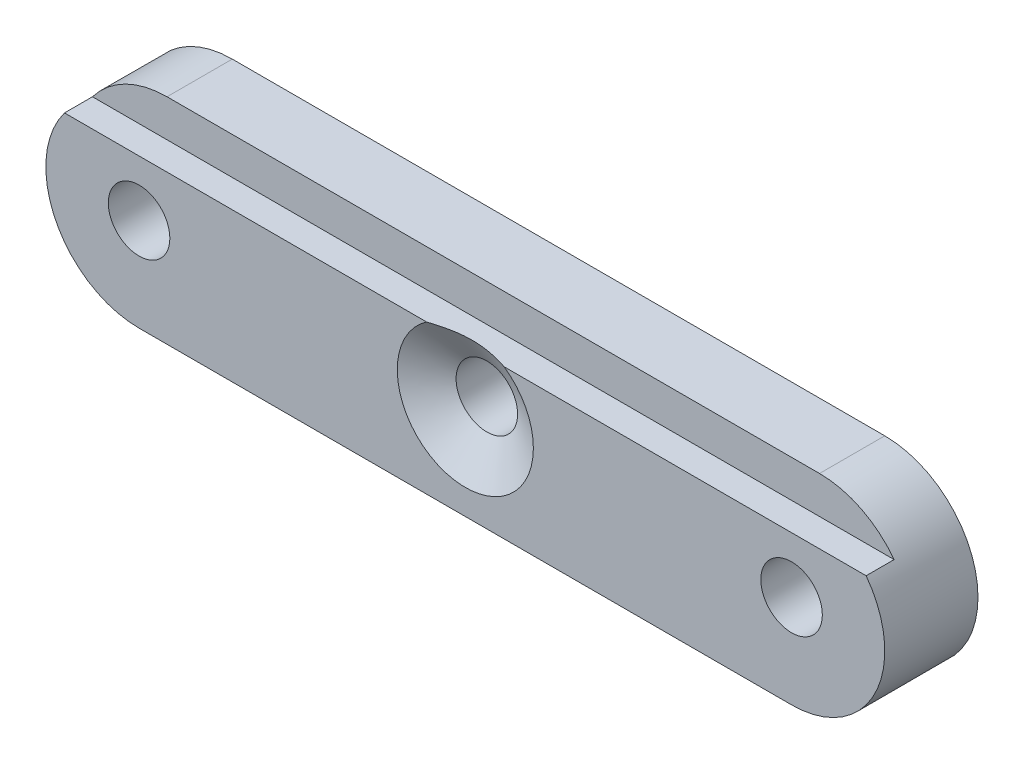
ISO-10303-21;
HEADER;
FILE_DESCRIPTION(('STEP AP214'),'2;1');
FILE_NAME('part.step','',(''),(''),'','','');
FILE_SCHEMA(('AUTOMOTIVE_DESIGN { 1 0 10303 214 1 1 1 1 }'));
ENDSEC;
DATA;
#1=APPLICATION_CONTEXT('core data for automotive mechanical design processes');
#2=APPLICATION_PROTOCOL_DEFINITION('international standard','automotive_design',2000,#1);
#3=PRODUCT_CONTEXT('',#1,'mechanical');
#4=PRODUCT('Part','Part','',(#3));
#5=PRODUCT_RELATED_PRODUCT_CATEGORY('part','',(#4));
#6=PRODUCT_DEFINITION_FORMATION('','',#4);
#7=PRODUCT_DEFINITION_CONTEXT('part definition',#1,'design');
#8=PRODUCT_DEFINITION('design','',#6,#7);
#9=PRODUCT_DEFINITION_SHAPE('','',#8);
#10=(LENGTH_UNIT() NAMED_UNIT(*) SI_UNIT(.MILLI.,.METRE.));
#11=(NAMED_UNIT(*) PLANE_ANGLE_UNIT() SI_UNIT($,.RADIAN.));
#12=(NAMED_UNIT(*) SI_UNIT($,.STERADIAN.) SOLID_ANGLE_UNIT());
#13=UNCERTAINTY_MEASURE_WITH_UNIT(LENGTH_MEASURE(1.E-05),#10,'distance_accuracy_value','');
#14=(GEOMETRIC_REPRESENTATION_CONTEXT(3) GLOBAL_UNCERTAINTY_ASSIGNED_CONTEXT((#13)) GLOBAL_UNIT_ASSIGNED_CONTEXT((#10,
#11,#12)) REPRESENTATION_CONTEXT('',''));
#15=CARTESIAN_POINT('',(0.,0.,0.));
#16=DIRECTION('',(0.,0.,1.));
#17=DIRECTION('',(1.,0.,0.));
#18=AXIS2_PLACEMENT_3D('',#15,#16,#17);
#19=CARTESIAN_POINT('',(0.,0.,5.));
#20=DIRECTION('',(0.,0.,1.));
#21=DIRECTION('',(1.,0.,0.));
#22=AXIS2_PLACEMENT_3D('',#19,#20,#21);
#23=PLANE('',#22);
#24=CARTESIAN_POINT('',(35.,0.,5.));
#25=DIRECTION('',(0.,0.,1.));
#26=DIRECTION('',(1.,0.,0.));
#27=AXIS2_PLACEMENT_3D('',#24,#25,#26);
#28=CIRCLE('',#27,1.65);
#29=CARTESIAN_POINT('',(36.65,0.,5.));
#30=VERTEX_POINT('',#29);
#31=EDGE_CURVE('E106',#30,#30,#28,.T.);
#32=ORIENTED_EDGE('',*,*,#31,.F.);
#33=EDGE_LOOP('',(#32));
#34=FACE_BOUND('',#33,.T.);
#35=CARTESIAN_POINT('',(0.,0.,5.));
#36=DIRECTION('',(0.,0.,1.));
#37=DIRECTION('',(1.,0.,0.));
#38=AXIS2_PLACEMENT_3D('',#35,#36,#37);
#39=CIRCLE('',#38,1.65);
#40=CARTESIAN_POINT('',(1.65,0.,5.));
#41=VERTEX_POINT('',#40);
#42=EDGE_CURVE('E270',#41,#41,#39,.T.);
#43=ORIENTED_EDGE('',*,*,#42,.F.);
#44=EDGE_LOOP('',(#43));
#45=FACE_BOUND('',#44,.T.);
#46=CARTESIAN_POINT('',(35.,0.,5.));
#47=DIRECTION('',(0.,0.,1.));
#48=DIRECTION('',(1.,0.,0.));
#49=AXIS2_PLACEMENT_3D('',#46,#47,#48);
#50=CIRCLE('',#49,5.);
#51=CARTESIAN_POINT('',(35.,-5.,5.));
#52=VERTEX_POINT('',#51);
#53=CARTESIAN_POINT('',(39.,3.,5.));
#54=VERTEX_POINT('',#53);
#55=EDGE_CURVE('E90',#52,#54,#50,.T.);
#56=ORIENTED_EDGE('',*,*,#55,.T.);
#57=DIRECTION('',(-1.,0.,0.));
#58=VECTOR('',#57,1.);
#59=CARTESIAN_POINT('',(47.5,3.,5.));
#60=LINE('',#59,#58);
#61=CARTESIAN_POINT('',(19.5790622886292,3.,5.));
#62=VERTEX_POINT('',#61);
#63=EDGE_CURVE('E263',#54,#62,#60,.T.);
#64=ORIENTED_EDGE('',*,*,#63,.T.);
#65=CARTESIAN_POINT('',(17.5,0.,5.));
#66=DIRECTION('',(0.,0.,1.));
#67=DIRECTION('',(1.,0.,0.));
#68=AXIS2_PLACEMENT_3D('',#65,#66,#67);
#69=CIRCLE('',#68,3.65000000000001);
#70=CARTESIAN_POINT('',(15.4209377113708,3.,5.));
#71=VERTEX_POINT('',#70);
#72=EDGE_CURVE('E125',#62,#71,#69,.F.);
#73=ORIENTED_EDGE('',*,*,#72,.T.);
#74=CARTESIAN_POINT('',(-3.99999999999998,3.,5.));
#75=VERTEX_POINT('',#74);
#76=EDGE_CURVE('E49',#71,#75,#60,.T.);
#77=ORIENTED_EDGE('',*,*,#76,.T.);
#78=CARTESIAN_POINT('',(0.,0.,5.));
#79=DIRECTION('',(0.,0.,1.));
#80=DIRECTION('',(1.,0.,0.));
#81=AXIS2_PLACEMENT_3D('',#78,#79,#80);
#82=CIRCLE('',#81,5.);
#83=CARTESIAN_POINT('',(0.,-5.,5.));
#84=VERTEX_POINT('',#83);
#85=EDGE_CURVE('E99',#75,#84,#82,.T.);
#86=ORIENTED_EDGE('',*,*,#85,.T.);
#87=DIRECTION('',(1.,0.,0.));
#88=VECTOR('',#87,1.);
#89=CARTESIAN_POINT('',(0.,-5.,5.));
#90=LINE('',#89,#88);
#91=EDGE_CURVE('E58',#84,#52,#90,.T.);
#92=ORIENTED_EDGE('',*,*,#91,.T.);
#93=EDGE_LOOP('',(#56,#64,#73,#77,#86,#92));
#94=FACE_BOUND('',#93,.T.);
#95=ADVANCED_FACE('F33',(#34,#45,#94),#23,.T.);
#96=CARTESIAN_POINT('',(0.,0.,5.));
#97=DIRECTION('',(0.,0.,-1.));
#98=DIRECTION('',(-1.,0.,0.));
#99=AXIS2_PLACEMENT_3D('',#96,#97,#98);
#100=CYLINDRICAL_SURFACE('',#99,5.);
#101=DIRECTION('',(0.,0.,-1.));
#102=VECTOR('',#101,1.);
#103=CARTESIAN_POINT('',(-4.,3.,5.));
#104=LINE('',#103,#102);
#105=CARTESIAN_POINT('',(-4.,3.,3.5));
#106=VERTEX_POINT('',#105);
#107=EDGE_CURVE('E255',#106,#75,#104,.F.);
#108=ORIENTED_EDGE('',*,*,#107,.F.);
#109=CARTESIAN_POINT('',(0.,0.,3.5));
#110=DIRECTION('',(0.,0.,1.));
#111=DIRECTION('',(1.,0.,0.));
#112=AXIS2_PLACEMENT_3D('',#109,#110,#111);
#113=CIRCLE('',#112,5.);
#114=CARTESIAN_POINT('',(0.,5.,3.5));
#115=VERTEX_POINT('',#114);
#116=EDGE_CURVE('E86',#115,#106,#113,.T.);
#117=ORIENTED_EDGE('',*,*,#116,.F.);
#118=DIRECTION('',(0.,0.,-1.));
#119=VECTOR('',#118,1.);
#120=CARTESIAN_POINT('',(0.,5.,5.));
#121=LINE('',#120,#119);
#122=CARTESIAN_POINT('',(0.,5.,0.));
#123=VERTEX_POINT('',#122);
#124=EDGE_CURVE('E78',#115,#123,#121,.T.);
#125=ORIENTED_EDGE('',*,*,#124,.T.);
#126=CARTESIAN_POINT('',(0.,0.,0.));
#127=DIRECTION('',(0.,0.,1.));
#128=DIRECTION('',(1.,0.,0.));
#129=AXIS2_PLACEMENT_3D('',#126,#127,#128);
#130=CIRCLE('',#129,5.);
#131=CARTESIAN_POINT('',(0.,-5.,0.));
#132=VERTEX_POINT('',#131);
#133=EDGE_CURVE('E84',#123,#132,#130,.T.);
#134=ORIENTED_EDGE('',*,*,#133,.T.);
#135=DIRECTION('',(0.,0.,-1.));
#136=VECTOR('',#135,1.);
#137=CARTESIAN_POINT('',(0.,-5.,5.));
#138=LINE('',#137,#136);
#139=EDGE_CURVE('E120',#84,#132,#138,.T.);
#140=ORIENTED_EDGE('',*,*,#139,.F.);
#141=ORIENTED_EDGE('',*,*,#85,.F.);
#142=EDGE_LOOP('',(#108,#117,#125,#134,#140,#141));
#143=FACE_BOUND('',#142,.T.);
#144=ADVANCED_FACE('F81',(#143),#100,.T.);
#145=CARTESIAN_POINT('',(35.,0.,5.));
#146=DIRECTION('',(0.,0.,-1.));
#147=DIRECTION('',(-1.,0.,0.));
#148=AXIS2_PLACEMENT_3D('',#145,#146,#147);
#149=CYLINDRICAL_SURFACE('',#148,5.);
#150=DIRECTION('',(0.,0.,-1.));
#151=VECTOR('',#150,1.);
#152=CARTESIAN_POINT('',(39.,3.,5.));
#153=LINE('',#152,#151);
#154=CARTESIAN_POINT('',(39.,3.,3.5));
#155=VERTEX_POINT('',#154);
#156=EDGE_CURVE('E258',#54,#155,#153,.T.);
#157=ORIENTED_EDGE('',*,*,#156,.F.);
#158=ORIENTED_EDGE('',*,*,#55,.F.);
#159=DIRECTION('',(0.,0.,-1.));
#160=VECTOR('',#159,1.);
#161=CARTESIAN_POINT('',(35.,-5.,5.));
#162=LINE('',#161,#160);
#163=CARTESIAN_POINT('',(35.,-5.,0.));
#164=VERTEX_POINT('',#163);
#165=EDGE_CURVE('E117',#52,#164,#162,.T.);
#166=ORIENTED_EDGE('',*,*,#165,.T.);
#167=CARTESIAN_POINT('',(35.,0.,0.));
#168=DIRECTION('',(0.,0.,1.));
#169=DIRECTION('',(1.,0.,0.));
#170=AXIS2_PLACEMENT_3D('',#167,#168,#169);
#171=CIRCLE('',#170,5.);
#172=CARTESIAN_POINT('',(35.,5.,0.));
#173=VERTEX_POINT('',#172);
#174=EDGE_CURVE('E100',#164,#173,#171,.T.);
#175=ORIENTED_EDGE('',*,*,#174,.T.);
#176=DIRECTION('',(0.,0.,-1.));
#177=VECTOR('',#176,1.);
#178=CARTESIAN_POINT('',(35.,5.,5.));
#179=LINE('',#178,#177);
#180=CARTESIAN_POINT('',(35.,5.,3.5));
#181=VERTEX_POINT('',#180);
#182=EDGE_CURVE('E89',#181,#173,#179,.T.);
#183=ORIENTED_EDGE('',*,*,#182,.F.);
#184=CARTESIAN_POINT('',(35.,0.,3.5));
#185=DIRECTION('',(0.,0.,1.));
#186=DIRECTION('',(1.,0.,0.));
#187=AXIS2_PLACEMENT_3D('',#184,#185,#186);
#188=CIRCLE('',#187,5.);
#189=EDGE_CURVE('E251',#155,#181,#188,.T.);
#190=ORIENTED_EDGE('',*,*,#189,.F.);
#191=EDGE_LOOP('',(#157,#158,#166,#175,#183,#190));
#192=FACE_BOUND('',#191,.T.);
#193=ADVANCED_FACE('F158',(#192),#149,.T.);
#194=CARTESIAN_POINT('',(0.,5.,5.));
#195=DIRECTION('',(0.,-1.,0.));
#196=DIRECTION('',(0.,0.,-1.));
#197=AXIS2_PLACEMENT_3D('',#194,#195,#196);
#198=PLANE('',#197);
#199=DIRECTION('',(-1.,0.,0.));
#200=VECTOR('',#199,1.);
#201=CARTESIAN_POINT('',(0.,5.,3.5));
#202=LINE('',#201,#200);
#203=EDGE_CURVE('E11',#181,#115,#202,.T.);
#204=ORIENTED_EDGE('',*,*,#203,.F.);
#205=ORIENTED_EDGE('',*,*,#182,.T.);
#206=DIRECTION('',(-1.,0.,0.));
#207=VECTOR('',#206,1.);
#208=CARTESIAN_POINT('',(0.,5.,0.));
#209=LINE('',#208,#207);
#210=EDGE_CURVE('E93',#173,#123,#209,.T.);
#211=ORIENTED_EDGE('',*,*,#210,.T.);
#212=ORIENTED_EDGE('',*,*,#124,.F.);
#213=EDGE_LOOP('',(#204,#205,#211,#212));
#214=FACE_BOUND('',#213,.T.);
#215=ADVANCED_FACE('F94',(#214),#198,.F.);
#216=CARTESIAN_POINT('',(17.5,0.,3.84529946162074));
#217=DIRECTION('',(0.,0.,1.));
#218=DIRECTION('',(1.,0.,0.));
#219=AXIS2_PLACEMENT_3D('',#216,#217,#218);
#220=CONICAL_SURFACE('',#219,1.65,1.0471975511966);
#221=CARTESIAN_POINT('',(17.5,0.,3.84529946162074));
#222=DIRECTION('',(0.,0.,1.));
#223=DIRECTION('',(1.,0.,0.));
#224=AXIS2_PLACEMENT_3D('',#221,#222,#223);
#225=CIRCLE('',#224,1.65);
#226=CARTESIAN_POINT('',(19.15,0.,3.84529946162074));
#227=VERTEX_POINT('',#226);
#228=EDGE_CURVE('E122',#227,#227,#225,.T.);
#229=ORIENTED_EDGE('',*,*,#228,.F.);
#230=EDGE_LOOP('',(#229));
#231=FACE_BOUND('',#230,.T.);
#232=ORIENTED_EDGE('',*,*,#72,.F.);
#233=CARTESIAN_POINT('',(11.8275768130364,3.,6.59746052683489));
#234=CARTESIAN_POINT('',(11.969636635737,3.,6.52497023774775));
#235=CARTESIAN_POINT('',(12.1119296973573,3.,6.45293206153359));
#236=CARTESIAN_POINT('',(12.3971038629693,3.,6.31000312791637));
#237=CARTESIAN_POINT('',(12.5399850102233,3.,6.23911245689244));
#238=CARTESIAN_POINT('',(12.8268276933058,3.,6.09854054025786));
#239=CARTESIAN_POINT('',(12.9707911158722,3.,6.02886313622713));
#240=CARTESIAN_POINT('',(13.2595532564117,3.,5.89126758392139));
#241=CARTESIAN_POINT('',(13.4043519521653,3.,5.82334938911087));
#242=CARTESIAN_POINT('',(13.7026184796863,3.,5.68620810345814));
#243=CARTESIAN_POINT('',(13.8561414474863,3.,5.61710449947381));
#244=CARTESIAN_POINT('',(14.1645746583202,3.,5.48206966045741));
#245=CARTESIAN_POINT('',(14.3194848393563,3.,5.41613828448168));
#246=CARTESIAN_POINT('',(14.6308728104923,3.,5.2884923875688));
#247=CARTESIAN_POINT('',(14.7873489769874,3.,5.22677393205871));
#248=CARTESIAN_POINT('',(15.102352002231,3.,5.1088495367629));
#249=CARTESIAN_POINT('',(15.2608784755092,3.,5.05264257735562));
#250=CARTESIAN_POINT('',(15.5787314917077,3.,4.94810250856732));
#251=CARTESIAN_POINT('',(15.7380330145845,3.,4.89969432556152));
#252=CARTESIAN_POINT('',(16.0592629013179,3.,4.81236546526751));
#253=CARTESIAN_POINT('',(16.2211911803825,3.,4.77344448237864));
#254=CARTESIAN_POINT('',(16.5445814827427,3.,4.70837266828685));
#255=CARTESIAN_POINT('',(16.7059982711544,3.,4.68200213770297));
#256=CARTESIAN_POINT('',(17.0305573874198,3.,4.64341112056473));
#257=CARTESIAN_POINT('',(17.1936993465158,3.,4.63118766937235));
#258=CARTESIAN_POINT('',(17.4523894647919,3.,4.62406104077253));
#259=CARTESIAN_POINT('',(17.5478199876218,3.,4.62406755535801));
#260=CARTESIAN_POINT('',(17.7385449598578,3.,4.62932031223674));
#261=CARTESIAN_POINT('',(17.8338394039979,3.,4.63456675208099));
#262=CARTESIAN_POINT('',(18.0240294431737,3.,4.65010664505003));
#263=CARTESIAN_POINT('',(18.1189249509847,3.,4.66040114935146));
#264=CARTESIAN_POINT('',(18.3080924691116,3.,4.68567115154001));
#265=CARTESIAN_POINT('',(18.4023644256005,3.,4.70064704829069));
#266=CARTESIAN_POINT('',(18.5925325253511,3.,4.73524884265784));
#267=CARTESIAN_POINT('',(18.6884086654694,3.,4.75498372298772));
#268=CARTESIAN_POINT('',(18.8792728788192,3.,4.79833792619136));
#269=CARTESIAN_POINT('',(18.9742609350221,3.,4.82195732338881));
#270=CARTESIAN_POINT('',(19.1633572561023,3.,4.87254793682486));
#271=CARTESIAN_POINT('',(19.2574653186948,3.,4.89951990429996));
#272=CARTESIAN_POINT('',(19.4448037916195,3.,4.95631845518158));
#273=CARTESIAN_POINT('',(19.5380342547708,3.,4.98614486556816));
#274=CARTESIAN_POINT('',(19.8174449915881,3.,5.07955185652153));
#275=CARTESIAN_POINT('',(20.0024000262049,3.,5.146798185452));
#276=CARTESIAN_POINT('',(20.369650848058,3.,5.28823769272562));
#277=CARTESIAN_POINT('',(20.5519458032977,3.,5.36243299286995));
#278=CARTESIAN_POINT('',(20.9145869826454,3.,5.51591329105389));
#279=CARTESIAN_POINT('',(21.0949310361938,3.,5.59520338890547));
#280=CARTESIAN_POINT('',(21.4539223425371,3.,5.75746058546618));
#281=CARTESIAN_POINT('',(21.6325697879091,3.,5.84042726065089));
#282=CARTESIAN_POINT('',(21.9892015344136,3.,6.00942841262702));
#283=CARTESIAN_POINT('',(22.1671810408569,3.,6.09547297428677));
#284=CARTESIAN_POINT('',(22.5220974038462,3.,6.26969064533454));
#285=CARTESIAN_POINT('',(22.6990342357614,3.,6.35786380475704));
#286=CARTESIAN_POINT('',(23.2284012385517,3.,6.62472921625863));
#287=CARTESIAN_POINT('',(23.5795968113178,3.,6.80586790660069));
#288=CARTESIAN_POINT('',(24.23286218171,3.,7.14767846114433));
#289=CARTESIAN_POINT('',(24.5352026613741,3.,7.30783654521936));
#290=CARTESIAN_POINT('',(25.1387579831346,3.,7.6303770956514));
#291=CARTESIAN_POINT('',(25.4399726329758,3.,7.79275992164634));
#292=CARTESIAN_POINT('',(26.0393802935299,3.,8.11794849984844));
#293=CARTESIAN_POINT('',(26.3375794872633,3.,8.2807428780765));
#294=CARTESIAN_POINT('',(26.9332610468696,3.,8.6075068892022));
#295=CARTESIAN_POINT('',(27.230743536346,3.,8.7714762966664));
#296=CARTESIAN_POINT('',(27.5279916409577,3.,8.93586648786649));
#297=B_SPLINE_CURVE_WITH_KNOTS('',3,(#233,#234,#235,#236,#237,#238,#239,#240,#241,#242,#243,
#244,#245,#246,#247,#248,#249,#250,#251,#252,#253,#254,#255,#256,#257,#258,#259,#260,#261,#262,
#263,#264,#265,#266,#267,#268,#269,#270,#271,#272,#273,#274,#275,#276,#277,#278,#279,#280,#281,
#282,#283,#284,#285,#286,#287,#288,#289,#290,#291,#292,#293,#294,#295,#296),.UNSPECIFIED.,.F.,
.F.,(4,2,2,2,2,2,2,2,2,2,2,2,2,2,2,2,2,2,2,2,2,2,2,2,2,2,2,2,2,2,2,4),(0.,0.478461037642833,
0.956957925778476,1.43676455831152,1.91655848575936,2.42160690489359,2.92663286371891,
3.43118052111506,3.93563466087101,4.43489773236646,4.93414471952818,5.42429772430315,
5.91434799483521,6.20050886121125,6.48668051657672,6.77291178781745,7.05916745315831,
7.35273337665137,7.64630491768729,7.9399423605726,8.23356201610037,8.82373799229105,
9.41409476418753,10.0050519681987,10.5959412727879,11.1889855754295,11.7820438316767,
12.9674650261525,13.9938791322107,15.0204611669965,16.0396849685133,17.0587182015138),.UNSPECIFIED.);
#298=EDGE_CURVE('E42',#62,#71,#297,.F.);
#299=ORIENTED_EDGE('',*,*,#298,.T.);
#300=EDGE_LOOP('',(#232,#299));
#301=FACE_BOUND('',#300,.T.);
#302=ADVANCED_FACE('F35',(#231,#301),#220,.F.);
#303=CARTESIAN_POINT('',(0.,0.,0.));
#304=DIRECTION('',(0.,0.,1.));
#305=DIRECTION('',(1.,0.,0.));
#306=AXIS2_PLACEMENT_3D('',#303,#304,#305);
#307=PLANE('',#306);
#308=CARTESIAN_POINT('',(17.5,0.,0.));
#309=DIRECTION('',(0.,0.,1.));
#310=DIRECTION('',(1.,0.,0.));
#311=AXIS2_PLACEMENT_3D('',#308,#309,#310);
#312=CIRCLE('',#311,1.65);
#313=CARTESIAN_POINT('',(19.15,0.,0.));
#314=VERTEX_POINT('',#313);
#315=EDGE_CURVE('E250',#314,#314,#312,.T.);
#316=ORIENTED_EDGE('',*,*,#315,.T.);
#317=EDGE_LOOP('',(#316));
#318=FACE_BOUND('',#317,.T.);
#319=ORIENTED_EDGE('',*,*,#133,.F.);
#320=ORIENTED_EDGE('',*,*,#210,.F.);
#321=ORIENTED_EDGE('',*,*,#174,.F.);
#322=DIRECTION('',(1.,0.,0.));
#323=VECTOR('',#322,1.);
#324=CARTESIAN_POINT('',(0.,-5.,0.));
#325=LINE('',#324,#323);
#326=EDGE_CURVE('E104',#132,#164,#325,.T.);
#327=ORIENTED_EDGE('',*,*,#326,.F.);
#328=EDGE_LOOP('',(#319,#320,#321,#327));
#329=FACE_BOUND('',#328,.T.);
#330=CARTESIAN_POINT('',(35.,0.,0.));
#331=DIRECTION('',(0.,0.,1.));
#332=DIRECTION('',(1.,0.,0.));
#333=AXIS2_PLACEMENT_3D('',#330,#331,#332);
#334=CIRCLE('',#333,1.65);
#335=CARTESIAN_POINT('',(36.65,0.,0.));
#336=VERTEX_POINT('',#335);
#337=EDGE_CURVE('E110',#336,#336,#334,.T.);
#338=ORIENTED_EDGE('',*,*,#337,.T.);
#339=EDGE_LOOP('',(#338));
#340=FACE_BOUND('',#339,.T.);
#341=CARTESIAN_POINT('',(0.,0.,0.));
#342=DIRECTION('',(0.,0.,1.));
#343=DIRECTION('',(1.,0.,0.));
#344=AXIS2_PLACEMENT_3D('',#341,#342,#343);
#345=CIRCLE('',#344,1.65);
#346=CARTESIAN_POINT('',(1.65,0.,0.));
#347=VERTEX_POINT('',#346);
#348=EDGE_CURVE('E269',#347,#347,#345,.T.);
#349=ORIENTED_EDGE('',*,*,#348,.T.);
#350=EDGE_LOOP('',(#349));
#351=FACE_BOUND('',#350,.T.);
#352=ADVANCED_FACE('F102',(#318,#329,#340,#351),#307,.F.);
#353=CARTESIAN_POINT('',(0.,-5.,5.));
#354=DIRECTION('',(0.,1.,0.));
#355=DIRECTION('',(0.,0.,1.));
#356=AXIS2_PLACEMENT_3D('',#353,#354,#355);
#357=PLANE('',#356);
#358=ORIENTED_EDGE('',*,*,#326,.T.);
#359=ORIENTED_EDGE('',*,*,#165,.F.);
#360=ORIENTED_EDGE('',*,*,#91,.F.);
#361=ORIENTED_EDGE('',*,*,#139,.T.);
#362=EDGE_LOOP('',(#358,#359,#360,#361));
#363=FACE_BOUND('',#362,.T.);
#364=ADVANCED_FACE('F148',(#363),#357,.F.);
#365=CARTESIAN_POINT('',(35.,0.,5.));
#366=DIRECTION('',(0.,0.,-1.));
#367=DIRECTION('',(-1.,0.,0.));
#368=AXIS2_PLACEMENT_3D('',#365,#366,#367);
#369=CYLINDRICAL_SURFACE('',#368,1.65);
#370=ORIENTED_EDGE('',*,*,#31,.T.);
#371=EDGE_LOOP('',(#370));
#372=FACE_BOUND('',#371,.T.);
#373=ORIENTED_EDGE('',*,*,#337,.F.);
#374=EDGE_LOOP('',(#373));
#375=FACE_BOUND('',#374,.T.);
#376=ADVANCED_FACE('F144',(#372,#375),#369,.F.);
#377=CARTESIAN_POINT('',(0.,0.,5.));
#378=DIRECTION('',(0.,0.,-1.));
#379=DIRECTION('',(-1.,0.,0.));
#380=AXIS2_PLACEMENT_3D('',#377,#378,#379);
#381=CYLINDRICAL_SURFACE('',#380,1.65);
#382=ORIENTED_EDGE('',*,*,#42,.T.);
#383=EDGE_LOOP('',(#382));
#384=FACE_BOUND('',#383,.T.);
#385=ORIENTED_EDGE('',*,*,#348,.F.);
#386=EDGE_LOOP('',(#385));
#387=FACE_BOUND('',#386,.T.);
#388=ADVANCED_FACE('F140',(#384,#387),#381,.F.);
#389=CARTESIAN_POINT('',(17.5,0.,0.));
#390=DIRECTION('',(0.,0.,1.));
#391=DIRECTION('',(1.,0.,0.));
#392=AXIS2_PLACEMENT_3D('',#389,#390,#391);
#393=CYLINDRICAL_SURFACE('',#392,1.65);
#394=ORIENTED_EDGE('',*,*,#228,.T.);
#395=EDGE_LOOP('',(#394));
#396=FACE_BOUND('',#395,.T.);
#397=ORIENTED_EDGE('',*,*,#315,.F.);
#398=EDGE_LOOP('',(#397));
#399=FACE_BOUND('',#398,.T.);
#400=ADVANCED_FACE('F137',(#396,#399),#393,.F.);
#401=CARTESIAN_POINT('',(47.5,3.,3.5));
#402=DIRECTION('',(0.,0.,1.));
#403=DIRECTION('',(1.,0.,0.));
#404=AXIS2_PLACEMENT_3D('',#401,#402,#403);
#405=PLANE('',#404);
#406=ORIENTED_EDGE('',*,*,#116,.T.);
#407=DIRECTION('',(-1.,0.,0.));
#408=VECTOR('',#407,1.);
#409=CARTESIAN_POINT('',(47.5,3.,3.5));
#410=LINE('',#409,#408);
#411=EDGE_CURVE('E246',#155,#106,#410,.T.);
#412=ORIENTED_EDGE('',*,*,#411,.F.);
#413=ORIENTED_EDGE('',*,*,#189,.T.);
#414=ORIENTED_EDGE('',*,*,#203,.T.);
#415=EDGE_LOOP('',(#406,#412,#413,#414));
#416=FACE_BOUND('',#415,.T.);
#417=ADVANCED_FACE('F136',(#416),#405,.T.);
#418=CARTESIAN_POINT('',(47.5,3.,5.));
#419=DIRECTION('',(0.,1.,0.));
#420=DIRECTION('',(0.,0.,1.));
#421=AXIS2_PLACEMENT_3D('',#418,#419,#420);
#422=PLANE('',#421);
#423=ORIENTED_EDGE('',*,*,#107,.T.);
#424=ORIENTED_EDGE('',*,*,#76,.F.);
#425=ORIENTED_EDGE('',*,*,#298,.F.);
#426=ORIENTED_EDGE('',*,*,#63,.F.);
#427=ORIENTED_EDGE('',*,*,#156,.T.);
#428=ORIENTED_EDGE('',*,*,#411,.T.);
#429=EDGE_LOOP('',(#423,#424,#425,#426,#427,#428));
#430=FACE_BOUND('',#429,.T.);
#431=ADVANCED_FACE('F131',(#430),#422,.T.);
#432=CLOSED_SHELL('',(#95,#144,#193,#215,#302,#352,#364,#376,#388,#400,#417,#431));
#433=MANIFOLD_SOLID_BREP('B2',#432);
#434=ADVANCED_BREP_SHAPE_REPRESENTATION('',(#18,#433),#14);
#435=SHAPE_DEFINITION_REPRESENTATION(#9,#434);
ENDSEC;
END-ISO-10303-21;
